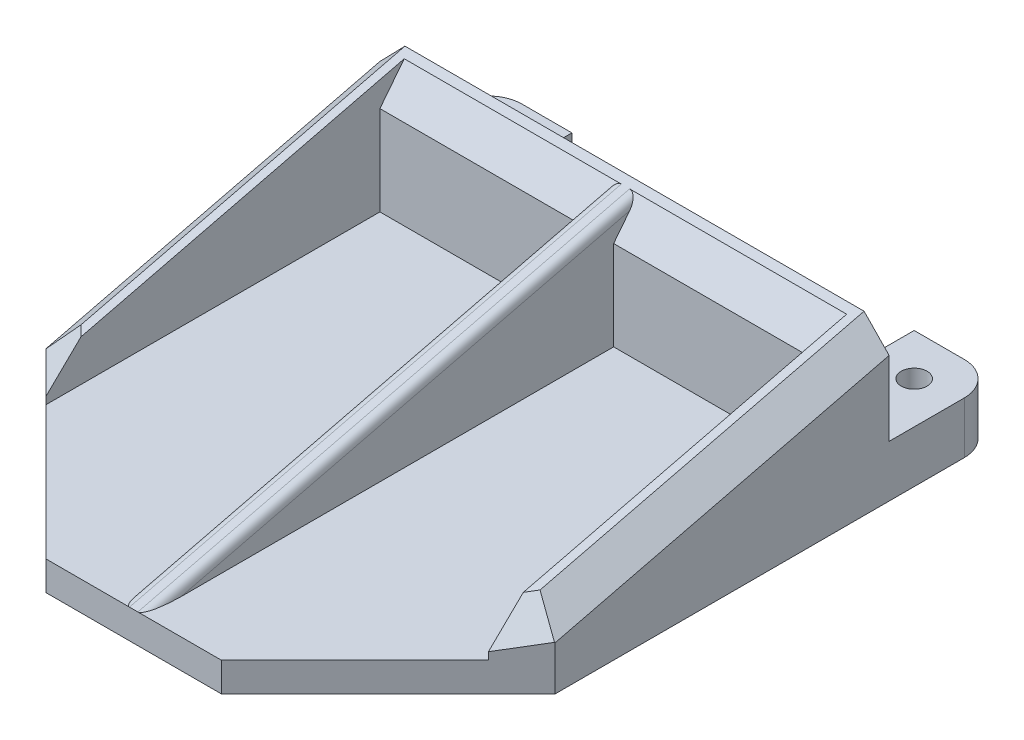
ISO-10303-21;
HEADER;
FILE_DESCRIPTION(('STEP AP214'),'2;1');
FILE_NAME('part.step','',(''),(''),'','','');
FILE_SCHEMA(('AUTOMOTIVE_DESIGN { 1 0 10303 214 1 1 1 1 }'));
ENDSEC;
DATA;
#1=APPLICATION_CONTEXT('core data for automotive mechanical design processes');
#2=APPLICATION_PROTOCOL_DEFINITION('international standard','automotive_design',2000,#1);
#3=PRODUCT_CONTEXT('',#1,'mechanical');
#4=PRODUCT('Part','Part','',(#3));
#5=PRODUCT_RELATED_PRODUCT_CATEGORY('part','',(#4));
#6=PRODUCT_DEFINITION_FORMATION('','',#4);
#7=PRODUCT_DEFINITION_CONTEXT('part definition',#1,'design');
#8=PRODUCT_DEFINITION('design','',#6,#7);
#9=PRODUCT_DEFINITION_SHAPE('','',#8);
#10=(LENGTH_UNIT() NAMED_UNIT(*) SI_UNIT(.MILLI.,.METRE.));
#11=(NAMED_UNIT(*) PLANE_ANGLE_UNIT() SI_UNIT($,.RADIAN.));
#12=(NAMED_UNIT(*) SI_UNIT($,.STERADIAN.) SOLID_ANGLE_UNIT());
#13=UNCERTAINTY_MEASURE_WITH_UNIT(LENGTH_MEASURE(1.E-05),#10,'distance_accuracy_value','');
#14=(GEOMETRIC_REPRESENTATION_CONTEXT(3) GLOBAL_UNCERTAINTY_ASSIGNED_CONTEXT((#13)) GLOBAL_UNIT_ASSIGNED_CONTEXT((#10,
#11,#12)) REPRESENTATION_CONTEXT('',''));
#15=CARTESIAN_POINT('',(0.,0.,0.));
#16=DIRECTION('',(0.,0.,1.));
#17=DIRECTION('',(1.,0.,0.));
#18=AXIS2_PLACEMENT_3D('',#15,#16,#17);
#19=CARTESIAN_POINT('',(30.5,1.75,0.));
#20=DIRECTION('',(1.,0.,0.));
#21=DIRECTION('',(0.,0.,-1.));
#22=AXIS2_PLACEMENT_3D('',#19,#20,#21);
#23=PLANE('',#22);
#24=DIRECTION('',(0.,1.,0.));
#25=VECTOR('',#24,1.);
#26=CARTESIAN_POINT('',(30.5,1.75,-28.5));
#27=LINE('',#26,#25);
#28=CARTESIAN_POINT('',(30.5,4.45,-28.5));
#29=VERTEX_POINT('',#28);
#30=CARTESIAN_POINT('',(30.5,13.3612745346988,-28.5));
#31=VERTEX_POINT('',#30);
#32=EDGE_CURVE('E557',#29,#31,#27,.T.);
#33=ORIENTED_EDGE('',*,*,#32,.T.);
#34=DIRECTION('',(0.,-0.237962230135701,0.971274408717147));
#35=VECTOR('',#34,1.);
#36=CARTESIAN_POINT('',(30.5,6.11666544156865,1.06983303318431));
#37=LINE('',#36,#35);
#38=CARTESIAN_POINT('',(30.5,3.5612745346988,11.5));
#39=VERTEX_POINT('',#38);
#40=EDGE_CURVE('E442',#31,#39,#37,.T.);
#41=ORIENTED_EDGE('',*,*,#40,.T.);
#42=DIRECTION('',(0.,-1.,0.));
#43=VECTOR('',#42,1.);
#44=CARTESIAN_POINT('',(30.5,1.75,11.5));
#45=LINE('',#44,#43);
#46=CARTESIAN_POINT('',(30.5,-1.75,11.5));
#47=VERTEX_POINT('',#46);
#48=EDGE_CURVE('E389',#39,#47,#45,.T.);
#49=ORIENTED_EDGE('',*,*,#48,.T.);
#50=DIRECTION('',(0.,0.,1.));
#51=VECTOR('',#50,1.);
#52=CARTESIAN_POINT('',(30.5,-1.75,0.));
#53=LINE('',#52,#51);
#54=CARTESIAN_POINT('',(30.5,-1.75,-37.5));
#55=VERTEX_POINT('',#54);
#56=EDGE_CURVE('E324',#55,#47,#53,.T.);
#57=ORIENTED_EDGE('',*,*,#56,.F.);
#58=DIRECTION('',(0.,-1.,0.));
#59=VECTOR('',#58,1.);
#60=CARTESIAN_POINT('',(30.5,1.75,-37.5));
#61=LINE('',#60,#59);
#62=CARTESIAN_POINT('',(30.5,4.45,-37.5));
#63=VERTEX_POINT('',#62);
#64=EDGE_CURVE('E386',#63,#55,#61,.T.);
#65=ORIENTED_EDGE('',*,*,#64,.F.);
#66=DIRECTION('',(0.,0.,-1.));
#67=VECTOR('',#66,1.);
#68=CARTESIAN_POINT('',(30.5,4.45,0.));
#69=LINE('',#68,#67);
#70=EDGE_CURVE('E577',#29,#63,#69,.T.);
#71=ORIENTED_EDGE('',*,*,#70,.F.);
#72=EDGE_LOOP('',(#33,#41,#49,#57,#65,#71));
#73=FACE_BOUND('',#72,.T.);
#74=ADVANCED_FACE('F78',(#73),#23,.T.);
#75=CARTESIAN_POINT('',(-30.5,1.75,0.));
#76=DIRECTION('',(1.,0.,0.));
#77=DIRECTION('',(0.,0.,-1.));
#78=AXIS2_PLACEMENT_3D('',#75,#76,#77);
#79=PLANE('',#78);
#80=DIRECTION('',(0.,-1.,0.));
#81=VECTOR('',#80,1.);
#82=CARTESIAN_POINT('',(-30.5,1.75,11.5));
#83=LINE('',#82,#81);
#84=CARTESIAN_POINT('',(-30.5,3.5612745346988,11.5));
#85=VERTEX_POINT('',#84);
#86=CARTESIAN_POINT('',(-30.5,-1.75,11.5));
#87=VERTEX_POINT('',#86);
#88=EDGE_CURVE('E311',#85,#87,#83,.T.);
#89=ORIENTED_EDGE('',*,*,#88,.F.);
#90=DIRECTION('',(0.,0.237962230135701,-0.971274408717147));
#91=VECTOR('',#90,1.);
#92=CARTESIAN_POINT('',(-30.5,13.5361767738485,-29.2138866904071));
#93=LINE('',#92,#91);
#94=CARTESIAN_POINT('',(-30.5,13.3612745346988,-28.5));
#95=VERTEX_POINT('',#94);
#96=EDGE_CURVE('E458',#85,#95,#93,.T.);
#97=ORIENTED_EDGE('',*,*,#96,.T.);
#98=DIRECTION('',(0.,1.,0.));
#99=VECTOR('',#98,1.);
#100=CARTESIAN_POINT('',(-30.5,1.75,-28.5));
#101=LINE('',#100,#99);
#102=CARTESIAN_POINT('',(-30.5,4.45,-28.5));
#103=VERTEX_POINT('',#102);
#104=EDGE_CURVE('E561',#103,#95,#101,.T.);
#105=ORIENTED_EDGE('',*,*,#104,.F.);
#106=DIRECTION('',(0.,0.,1.));
#107=VECTOR('',#106,1.);
#108=CARTESIAN_POINT('',(-30.5,4.45,0.));
#109=LINE('',#108,#107);
#110=CARTESIAN_POINT('',(-30.5,4.45,-37.5));
#111=VERTEX_POINT('',#110);
#112=EDGE_CURVE('E569',#111,#103,#109,.T.);
#113=ORIENTED_EDGE('',*,*,#112,.F.);
#114=DIRECTION('',(0.,-1.,0.));
#115=VECTOR('',#114,1.);
#116=CARTESIAN_POINT('',(-30.5,1.75,-37.5));
#117=LINE('',#116,#115);
#118=CARTESIAN_POINT('',(-30.5,-1.75,-37.5));
#119=VERTEX_POINT('',#118);
#120=EDGE_CURVE('E363',#111,#119,#117,.T.);
#121=ORIENTED_EDGE('',*,*,#120,.T.);
#122=DIRECTION('',(0.,0.,1.));
#123=VECTOR('',#122,1.);
#124=CARTESIAN_POINT('',(-30.5,-1.75,0.));
#125=LINE('',#124,#123);
#126=EDGE_CURVE('E354',#119,#87,#125,.T.);
#127=ORIENTED_EDGE('',*,*,#126,.T.);
#128=EDGE_LOOP('',(#89,#97,#105,#113,#121,#127));
#129=FACE_BOUND('',#128,.T.);
#130=ADVANCED_FACE('F636',(#129),#79,.F.);
#131=CARTESIAN_POINT('',(-30.5,1.75,31.5));
#132=DIRECTION('',(0.,0.971274408717147,0.237962230135701));
#133=DIRECTION('',(0.,-0.237962230135701,0.971274408717147));
#134=AXIS2_PLACEMENT_3D('',#131,#132,#133);
#135=PLANE('',#134);
#136=DIRECTION('',(-1.,0.,0.));
#137=VECTOR('',#136,1.);
#138=CARTESIAN_POINT('',(0.,1.75,31.5));
#139=LINE('',#138,#137);
#140=CARTESIAN_POINT('',(0.500000000000004,1.75,31.5));
#141=VERTEX_POINT('',#140);
#142=CARTESIAN_POINT('',(-0.500000000000004,1.75,31.5));
#143=VERTEX_POINT('',#142);
#144=EDGE_CURVE('E301',#141,#143,#139,.T.);
#145=ORIENTED_EDGE('',*,*,#144,.F.);
#146=DIRECTION('',(0.,-0.237962230135701,0.971274408717147));
#147=VECTOR('',#146,1.);
#148=CARTESIAN_POINT('',(0.499999999999982,16.1838866904071,-27.4138232261515));
#149=LINE('',#148,#147);
#150=CARTESIAN_POINT('',(0.499999999999983,16.1838866904071,-27.4138232261515));
#151=VERTEX_POINT('',#150);
#152=EDGE_CURVE('E491',#141,#151,#149,.F.);
#153=ORIENTED_EDGE('',*,*,#152,.T.);
#154=DIRECTION('',(1.,0.,0.));
#155=VECTOR('',#154,1.);
#156=CARTESIAN_POINT('',(26.5,16.1838866904071,-27.4138232261515));
#157=LINE('',#156,#155);
#158=CARTESIAN_POINT('',(26.5,16.1838866904071,-27.4138232261515));
#159=VERTEX_POINT('',#158);
#160=EDGE_CURVE('E414',#151,#159,#157,.T.);
#161=ORIENTED_EDGE('',*,*,#160,.T.);
#162=DIRECTION('',(0.,-0.237962230135701,0.971274408717147));
#163=VECTOR('',#162,1.);
#164=CARTESIAN_POINT('',(26.5,1.75000000000001,31.5));
#165=LINE('',#164,#163);
#166=CARTESIAN_POINT('',(26.5,6.69462637421668,11.3178515338095));
#167=VERTEX_POINT('',#166);
#168=EDGE_CURVE('E397',#159,#167,#165,.T.);
#169=ORIENTED_EDGE('',*,*,#168,.T.);
#170=DIRECTION('',(0.696728786581225,0.1706985527124,-0.696728786581225));
#171=VECTOR('',#170,1.);
#172=CARTESIAN_POINT('',(-11.5546750296106,-2.62876900803793,49.3725265634201));
#173=LINE('',#172,#171);
#174=CARTESIAN_POINT('',(27.5,6.93962637421667,10.3178515338095));
#175=VERTEX_POINT('',#174);
#176=EDGE_CURVE('E421',#167,#175,#173,.T.);
#177=ORIENTED_EDGE('',*,*,#176,.T.);
#178=DIRECTION('',(0.,0.237962230135701,-0.971274408717147));
#179=VECTOR('',#178,1.);
#180=CARTESIAN_POINT('',(27.5,1.75,31.5));
#181=LINE('',#180,#179);
#182=CARTESIAN_POINT('',(27.5,16.45,-28.5));
#183=VERTEX_POINT('',#182);
#184=EDGE_CURVE('E418',#175,#183,#181,.T.);
#185=ORIENTED_EDGE('',*,*,#184,.T.);
#186=DIRECTION('',(1.,0.,0.));
#187=VECTOR('',#186,1.);
#188=CARTESIAN_POINT('',(-30.5,16.45,-28.5));
#189=LINE('',#188,#187);
#190=CARTESIAN_POINT('',(-27.5,16.45,-28.5));
#191=VERTEX_POINT('',#190);
#192=EDGE_CURVE('E565',#191,#183,#189,.T.);
#193=ORIENTED_EDGE('',*,*,#192,.F.);
#194=DIRECTION('',(0.,-0.237962230135701,0.971274408717147));
#195=VECTOR('',#194,1.);
#196=CARTESIAN_POINT('',(-27.5,6.65,11.5));
#197=LINE('',#196,#195);
#198=CARTESIAN_POINT('',(-27.5,6.93962637421668,10.3178515338095));
#199=VERTEX_POINT('',#198);
#200=EDGE_CURVE('E404',#191,#199,#197,.T.);
#201=ORIENTED_EDGE('',*,*,#200,.T.);
#202=DIRECTION('',(0.696728786581225,-0.1706985527124,0.696728786581225));
#203=VECTOR('',#202,1.);
#204=CARTESIAN_POINT('',(-18.0566160954971,4.62599731761347,19.7612354383124));
#205=LINE('',#204,#203);
#206=CARTESIAN_POINT('',(-26.5,6.69462637421668,11.3178515338095));
#207=VERTEX_POINT('',#206);
#208=EDGE_CURVE('E407',#199,#207,#205,.T.);
#209=ORIENTED_EDGE('',*,*,#208,.T.);
#210=DIRECTION('',(0.,-0.237962230135701,0.971274408717147));
#211=VECTOR('',#210,1.);
#212=CARTESIAN_POINT('',(-26.5,1.75,31.5));
#213=LINE('',#212,#211);
#214=CARTESIAN_POINT('',(-26.5,16.1838866904071,-27.4138232261515));
#215=VERTEX_POINT('',#214);
#216=EDGE_CURVE('E401',#215,#207,#213,.T.);
#217=ORIENTED_EDGE('',*,*,#216,.F.);
#218=DIRECTION('',(1.,0.,0.));
#219=VECTOR('',#218,1.);
#220=CARTESIAN_POINT('',(-30.5,16.1838866904071,-27.4138232261515));
#221=LINE('',#220,#219);
#222=CARTESIAN_POINT('',(-0.499999999999994,16.1838866904071,-27.4138232261515));
#223=VERTEX_POINT('',#222);
#224=EDGE_CURVE('E411',#215,#223,#221,.T.);
#225=ORIENTED_EDGE('',*,*,#224,.T.);
#226=DIRECTION('',(0.,-0.237962230135701,0.971274408717147));
#227=VECTOR('',#226,1.);
#228=CARTESIAN_POINT('',(-0.500000000000004,1.75,31.5));
#229=LINE('',#228,#227);
#230=EDGE_CURVE('E487',#223,#143,#229,.T.);
#231=ORIENTED_EDGE('',*,*,#230,.T.);
#232=EDGE_LOOP('',(#145,#153,#161,#169,#177,#185,#193,#201,#209,#217,#225,#231));
#233=FACE_BOUND('',#232,.T.);
#234=ADVANCED_FACE('F642',(#233),#135,.T.);
#235=CARTESIAN_POINT('',(-21.,1.75,21.));
#236=DIRECTION('',(-0.707106781186548,0.,0.707106781186548));
#237=DIRECTION('',(0.707106781186548,0.,0.707106781186547));
#238=AXIS2_PLACEMENT_3D('',#235,#236,#237);
#239=PLANE('',#238);
#240=DIRECTION('',(0.,1.,0.));
#241=VECTOR('',#240,1.);
#242=CARTESIAN_POINT('',(-26.5,1.75,15.5));
#243=LINE('',#242,#241);
#244=CARTESIAN_POINT('',(-26.5,1.75,15.5));
#245=VERTEX_POINT('',#244);
#246=CARTESIAN_POINT('',(-26.5,2.6253140556044,15.5));
#247=VERTEX_POINT('',#246);
#248=EDGE_CURVE('E266',#245,#247,#243,.T.);
#249=ORIENTED_EDGE('',*,*,#248,.T.);
#250=DIRECTION('',(-0.696728786581225,0.1706985527124,-0.696728786581225));
#251=VECTOR('',#250,1.);
#252=CARTESIAN_POINT('',(-21.0561573555549,1.29157260771534,20.9438426444451));
#253=LINE('',#252,#251);
#254=CARTESIAN_POINT('',(-30.4572255403722,3.59483431299559,11.5427744596278));
#255=VERTEX_POINT('',#254);
#256=EDGE_CURVE('E439',#247,#255,#253,.T.);
#257=ORIENTED_EDGE('',*,*,#256,.T.);
#258=DIRECTION('',(-0.618326426470226,-0.485123551950552,-0.618326426470226));
#259=VECTOR('',#258,1.);
#260=CARTESIAN_POINT('',(-23.779094620893,8.83432991492676,18.220905379107));
#261=LINE('',#260,#259);
#262=EDGE_CURVE('E436',#255,#85,#261,.T.);
#263=ORIENTED_EDGE('',*,*,#262,.T.);
#264=ORIENTED_EDGE('',*,*,#88,.T.);
#265=DIRECTION('',(-0.707106781186548,0.,-0.707106781186547));
#266=VECTOR('',#265,1.);
#267=CARTESIAN_POINT('',(-21.,-1.75,21.));
#268=LINE('',#267,#266);
#269=CARTESIAN_POINT('',(-10.5,-1.75,31.5));
#270=VERTEX_POINT('',#269);
#271=EDGE_CURVE('E312',#270,#87,#268,.T.);
#272=ORIENTED_EDGE('',*,*,#271,.F.);
#273=DIRECTION('',(0.,-1.,0.));
#274=VECTOR('',#273,1.);
#275=CARTESIAN_POINT('',(-10.5,1.75,31.5));
#276=LINE('',#275,#274);
#277=CARTESIAN_POINT('',(-10.5,1.75,31.5));
#278=VERTEX_POINT('',#277);
#279=EDGE_CURVE('E294',#278,#270,#276,.T.);
#280=ORIENTED_EDGE('',*,*,#279,.F.);
#281=DIRECTION('',(-0.707106781186548,0.,-0.707106781186547));
#282=VECTOR('',#281,1.);
#283=CARTESIAN_POINT('',(-21.,1.75,21.));
#284=LINE('',#283,#282);
#285=EDGE_CURVE('E284',#278,#245,#284,.T.);
#286=ORIENTED_EDGE('',*,*,#285,.T.);
#287=EDGE_LOOP('',(#249,#257,#263,#264,#272,#280,#286));
#288=FACE_BOUND('',#287,.T.);
#289=ADVANCED_FACE('F292',(#288),#239,.T.);
#290=CARTESIAN_POINT('',(0.,1.75,31.5));
#291=DIRECTION('',(0.,0.,1.));
#292=DIRECTION('',(1.,0.,0.));
#293=AXIS2_PLACEMENT_3D('',#290,#291,#292);
#294=PLANE('',#293);
#295=DIRECTION('',(-1.,0.,0.));
#296=VECTOR('',#295,1.);
#297=CARTESIAN_POINT('',(0.,-1.75,31.5));
#298=LINE('',#297,#296);
#299=CARTESIAN_POINT('',(10.5,-1.75,31.5));
#300=VERTEX_POINT('',#299);
#301=EDGE_CURVE('E316',#300,#270,#298,.T.);
#302=ORIENTED_EDGE('',*,*,#301,.F.);
#303=DIRECTION('',(0.,-1.,0.));
#304=VECTOR('',#303,1.);
#305=CARTESIAN_POINT('',(10.5,1.75,31.5));
#306=LINE('',#305,#304);
#307=CARTESIAN_POINT('',(10.5,1.75,31.5));
#308=VERTEX_POINT('',#307);
#309=EDGE_CURVE('E392',#308,#300,#306,.T.);
#310=ORIENTED_EDGE('',*,*,#309,.F.);
#311=EDGE_CURVE('E95',#308,#141,#139,.T.);
#312=ORIENTED_EDGE('',*,*,#311,.T.);
#313=ORIENTED_EDGE('',*,*,#144,.T.);
#314=EDGE_CURVE('E296',#143,#278,#139,.T.);
#315=ORIENTED_EDGE('',*,*,#314,.T.);
#316=ORIENTED_EDGE('',*,*,#279,.T.);
#317=EDGE_LOOP('',(#302,#310,#312,#313,#315,#316));
#318=FACE_BOUND('',#317,.T.);
#319=ADVANCED_FACE('F652',(#318),#294,.T.);
#320=CARTESIAN_POINT('',(21.,1.75,21.));
#321=DIRECTION('',(0.707106781186548,0.,0.707106781186548));
#322=DIRECTION('',(0.707106781186547,0.,-0.707106781186548));
#323=AXIS2_PLACEMENT_3D('',#320,#321,#322);
#324=PLANE('',#323);
#325=DIRECTION('',(0.618326426470227,-0.48512355195055,-0.618326426470227));
#326=VECTOR('',#325,1.);
#327=CARTESIAN_POINT('',(23.779094620893,8.83432991492674,18.220905379107));
#328=LINE('',#327,#326);
#329=CARTESIAN_POINT('',(30.4572255403722,3.59483431299561,11.5427744596278));
#330=VERTEX_POINT('',#329);
#331=EDGE_CURVE('E425',#39,#330,#328,.F.);
#332=ORIENTED_EDGE('',*,*,#331,.T.);
#333=DIRECTION('',(-0.696728786581225,-0.1706985527124,0.696728786581225));
#334=VECTOR('',#333,1.);
#335=CARTESIAN_POINT('',(21.0561573555549,1.29157260771535,20.9438426444451));
#336=LINE('',#335,#334);
#337=CARTESIAN_POINT('',(26.5,2.62531405560441,15.5));
#338=VERTEX_POINT('',#337);
#339=EDGE_CURVE('E428',#330,#338,#336,.T.);
#340=ORIENTED_EDGE('',*,*,#339,.T.);
#341=DIRECTION('',(0.,1.,0.));
#342=VECTOR('',#341,1.);
#343=CARTESIAN_POINT('',(26.5,1.75,15.5));
#344=LINE('',#343,#342);
#345=CARTESIAN_POINT('',(26.5,1.75,15.5));
#346=VERTEX_POINT('',#345);
#347=EDGE_CURVE('E479',#346,#338,#344,.T.);
#348=ORIENTED_EDGE('',*,*,#347,.F.);
#349=DIRECTION('',(0.707106781186547,0.,-0.707106781186548));
#350=VECTOR('',#349,1.);
#351=CARTESIAN_POINT('',(21.,1.75,21.));
#352=LINE('',#351,#350);
#353=EDGE_CURVE('E277',#308,#346,#352,.T.);
#354=ORIENTED_EDGE('',*,*,#353,.F.);
#355=ORIENTED_EDGE('',*,*,#309,.T.);
#356=DIRECTION('',(-0.707106781186547,0.,0.707106781186548));
#357=VECTOR('',#356,1.);
#358=CARTESIAN_POINT('',(21.,-1.75,21.));
#359=LINE('',#358,#357);
#360=EDGE_CURVE('E320',#47,#300,#359,.T.);
#361=ORIENTED_EDGE('',*,*,#360,.F.);
#362=ORIENTED_EDGE('',*,*,#48,.F.);
#363=EDGE_LOOP('',(#332,#340,#348,#354,#355,#361,#362));
#364=FACE_BOUND('',#363,.T.);
#365=ADVANCED_FACE('F649',(#364),#324,.T.);
#366=CARTESIAN_POINT('',(26.5,1.75,-37.5));
#367=DIRECTION('',(0.,-1.,0.));
#368=DIRECTION('',(0.,0.,-1.));
#369=AXIS2_PLACEMENT_3D('',#366,#367,#368);
#370=CYLINDRICAL_SURFACE('',#369,4.);
#371=CARTESIAN_POINT('',(26.5,-1.75,-37.5));
#372=DIRECTION('',(0.,1.,0.));
#373=DIRECTION('',(0.,0.,1.));
#374=AXIS2_PLACEMENT_3D('',#371,#372,#373);
#375=CIRCLE('',#374,4.);
#376=CARTESIAN_POINT('',(26.5,-1.75,-41.5));
#377=VERTEX_POINT('',#376);
#378=EDGE_CURVE('E328',#55,#377,#375,.T.);
#379=ORIENTED_EDGE('',*,*,#378,.T.);
#380=DIRECTION('',(0.,-1.,0.));
#381=VECTOR('',#380,1.);
#382=CARTESIAN_POINT('',(26.5,1.75,-41.5));
#383=LINE('',#382,#381);
#384=CARTESIAN_POINT('',(26.5,4.45,-41.5));
#385=VERTEX_POINT('',#384);
#386=EDGE_CURVE('E382',#385,#377,#383,.T.);
#387=ORIENTED_EDGE('',*,*,#386,.F.);
#388=CARTESIAN_POINT('',(26.5,4.45,-37.5));
#389=DIRECTION('',(0.,1.,0.));
#390=DIRECTION('',(0.,0.,1.));
#391=AXIS2_PLACEMENT_3D('',#388,#389,#390);
#392=CIRCLE('',#391,4.);
#393=EDGE_CURVE('E581',#63,#385,#392,.T.);
#394=ORIENTED_EDGE('',*,*,#393,.F.);
#395=ORIENTED_EDGE('',*,*,#64,.T.);
#396=EDGE_LOOP('',(#379,#387,#394,#395));
#397=FACE_BOUND('',#396,.T.);
#398=ADVANCED_FACE('F647',(#397),#370,.T.);
#399=CARTESIAN_POINT('',(0.,1.75,-41.5));
#400=DIRECTION('',(0.,0.,1.));
#401=DIRECTION('',(1.,0.,0.));
#402=AXIS2_PLACEMENT_3D('',#399,#400,#401);
#403=PLANE('',#402);
#404=DIRECTION('',(-1.,0.,0.));
#405=VECTOR('',#404,1.);
#406=CARTESIAN_POINT('',(0.,-1.75,-41.5));
#407=LINE('',#406,#405);
#408=CARTESIAN_POINT('',(20.5,-1.75,-41.5));
#409=VERTEX_POINT('',#408);
#410=EDGE_CURVE('E331',#377,#409,#407,.T.);
#411=ORIENTED_EDGE('',*,*,#410,.T.);
#412=DIRECTION('',(0.,-1.,0.));
#413=VECTOR('',#412,1.);
#414=CARTESIAN_POINT('',(20.5,1.75,-41.5));
#415=LINE('',#414,#413);
#416=CARTESIAN_POINT('',(20.5,4.45,-41.5));
#417=VERTEX_POINT('',#416);
#418=EDGE_CURVE('E379',#417,#409,#415,.T.);
#419=ORIENTED_EDGE('',*,*,#418,.F.);
#420=DIRECTION('',(-1.,0.,0.));
#421=VECTOR('',#420,1.);
#422=CARTESIAN_POINT('',(0.,4.45,-41.5));
#423=LINE('',#422,#421);
#424=EDGE_CURVE('E585',#385,#417,#423,.T.);
#425=ORIENTED_EDGE('',*,*,#424,.F.);
#426=ORIENTED_EDGE('',*,*,#386,.T.);
#427=EDGE_LOOP('',(#411,#419,#425,#426));
#428=FACE_BOUND('',#427,.T.);
#429=ADVANCED_FACE('F749',(#428),#403,.F.);
#430=CARTESIAN_POINT('',(20.5,1.75,0.));
#431=DIRECTION('',(-1.,0.,0.));
#432=DIRECTION('',(0.,0.,1.));
#433=AXIS2_PLACEMENT_3D('',#430,#431,#432);
#434=PLANE('',#433);
#435=DIRECTION('',(0.,0.,-1.));
#436=VECTOR('',#435,1.);
#437=CARTESIAN_POINT('',(20.5,-1.75,0.));
#438=LINE('',#437,#436);
#439=CARTESIAN_POINT('',(20.5,-1.75,-31.5));
#440=VERTEX_POINT('',#439);
#441=EDGE_CURVE('E335',#440,#409,#438,.T.);
#442=ORIENTED_EDGE('',*,*,#441,.F.);
#443=DIRECTION('',(0.,-1.,0.));
#444=VECTOR('',#443,1.);
#445=CARTESIAN_POINT('',(20.5,1.75,-31.5));
#446=LINE('',#445,#444);
#447=CARTESIAN_POINT('',(20.5,4.45,-31.5));
#448=VERTEX_POINT('',#447);
#449=EDGE_CURVE('E376',#448,#440,#446,.T.);
#450=ORIENTED_EDGE('',*,*,#449,.F.);
#451=DIRECTION('',(0.,0.,1.));
#452=VECTOR('',#451,1.);
#453=CARTESIAN_POINT('',(20.5,4.45,0.));
#454=LINE('',#453,#452);
#455=EDGE_CURVE('E589',#417,#448,#454,.T.);
#456=ORIENTED_EDGE('',*,*,#455,.F.);
#457=ORIENTED_EDGE('',*,*,#418,.T.);
#458=EDGE_LOOP('',(#442,#450,#456,#457));
#459=FACE_BOUND('',#458,.T.);
#460=ADVANCED_FACE('F754',(#459),#434,.T.);
#461=CARTESIAN_POINT('',(0.,1.75,-31.5));
#462=DIRECTION('',(0.,0.,1.));
#463=DIRECTION('',(1.,0.,0.));
#464=AXIS2_PLACEMENT_3D('',#461,#462,#463);
#465=PLANE('',#464);
#466=DIRECTION('',(-1.,0.,0.));
#467=VECTOR('',#466,1.);
#468=CARTESIAN_POINT('',(0.,-1.75,-31.5));
#469=LINE('',#468,#467);
#470=CARTESIAN_POINT('',(-20.5,-1.75,-31.5));
#471=VERTEX_POINT('',#470);
#472=EDGE_CURVE('E339',#440,#471,#469,.T.);
#473=ORIENTED_EDGE('',*,*,#472,.T.);
#474=DIRECTION('',(0.,-1.,0.));
#475=VECTOR('',#474,1.);
#476=CARTESIAN_POINT('',(-20.5,1.75,-31.5));
#477=LINE('',#476,#475);
#478=CARTESIAN_POINT('',(-20.5,4.45,-31.5));
#479=VERTEX_POINT('',#478);
#480=EDGE_CURVE('E372',#479,#471,#477,.T.);
#481=ORIENTED_EDGE('',*,*,#480,.F.);
#482=DIRECTION('',(1.,0.,0.));
#483=VECTOR('',#482,1.);
#484=CARTESIAN_POINT('',(0.,4.45,-31.5));
#485=LINE('',#484,#483);
#486=EDGE_CURVE('E593',#479,#448,#485,.T.);
#487=ORIENTED_EDGE('',*,*,#486,.T.);
#488=ORIENTED_EDGE('',*,*,#449,.T.);
#489=EDGE_LOOP('',(#473,#481,#487,#488));
#490=FACE_BOUND('',#489,.T.);
#491=ADVANCED_FACE('F758',(#490),#465,.F.);
#492=CARTESIAN_POINT('',(-20.5,1.75,0.));
#493=DIRECTION('',(-1.,0.,0.));
#494=DIRECTION('',(0.,0.,1.));
#495=AXIS2_PLACEMENT_3D('',#492,#493,#494);
#496=PLANE('',#495);
#497=DIRECTION('',(0.,0.,-1.));
#498=VECTOR('',#497,1.);
#499=CARTESIAN_POINT('',(-20.5,-1.75,0.));
#500=LINE('',#499,#498);
#501=CARTESIAN_POINT('',(-20.5,-1.75,-41.5));
#502=VERTEX_POINT('',#501);
#503=EDGE_CURVE('E342',#471,#502,#500,.T.);
#504=ORIENTED_EDGE('',*,*,#503,.T.);
#505=DIRECTION('',(0.,-1.,0.));
#506=VECTOR('',#505,1.);
#507=CARTESIAN_POINT('',(-20.5,1.75,-41.5));
#508=LINE('',#507,#506);
#509=CARTESIAN_POINT('',(-20.5,4.45,-41.5));
#510=VERTEX_POINT('',#509);
#511=EDGE_CURVE('E369',#510,#502,#508,.T.);
#512=ORIENTED_EDGE('',*,*,#511,.F.);
#513=DIRECTION('',(0.,0.,-1.));
#514=VECTOR('',#513,1.);
#515=CARTESIAN_POINT('',(-20.5,4.45,0.));
#516=LINE('',#515,#514);
#517=EDGE_CURVE('E597',#479,#510,#516,.T.);
#518=ORIENTED_EDGE('',*,*,#517,.F.);
#519=ORIENTED_EDGE('',*,*,#480,.T.);
#520=EDGE_LOOP('',(#504,#512,#518,#519));
#521=FACE_BOUND('',#520,.T.);
#522=ADVANCED_FACE('F761',(#521),#496,.F.);
#523=CARTESIAN_POINT('',(0.,1.75,-41.5));
#524=DIRECTION('',(0.,0.,-1.));
#525=DIRECTION('',(-1.,0.,0.));
#526=AXIS2_PLACEMENT_3D('',#523,#524,#525);
#527=PLANE('',#526);
#528=DIRECTION('',(1.,0.,0.));
#529=VECTOR('',#528,1.);
#530=CARTESIAN_POINT('',(0.,-1.75,-41.5));
#531=LINE('',#530,#529);
#532=CARTESIAN_POINT('',(-26.5,-1.75,-41.5));
#533=VERTEX_POINT('',#532);
#534=EDGE_CURVE('E346',#533,#502,#531,.T.);
#535=ORIENTED_EDGE('',*,*,#534,.F.);
#536=DIRECTION('',(0.,-1.,0.));
#537=VECTOR('',#536,1.);
#538=CARTESIAN_POINT('',(-26.5,1.75,-41.5));
#539=LINE('',#538,#537);
#540=CARTESIAN_POINT('',(-26.5,4.45,-41.5));
#541=VERTEX_POINT('',#540);
#542=EDGE_CURVE('E366',#541,#533,#539,.T.);
#543=ORIENTED_EDGE('',*,*,#542,.F.);
#544=DIRECTION('',(-1.,0.,0.));
#545=VECTOR('',#544,1.);
#546=CARTESIAN_POINT('',(0.,4.45,-41.5));
#547=LINE('',#546,#545);
#548=EDGE_CURVE('E601',#510,#541,#547,.T.);
#549=ORIENTED_EDGE('',*,*,#548,.F.);
#550=ORIENTED_EDGE('',*,*,#511,.T.);
#551=EDGE_LOOP('',(#535,#543,#549,#550));
#552=FACE_BOUND('',#551,.T.);
#553=ADVANCED_FACE('F766',(#552),#527,.T.);
#554=CARTESIAN_POINT('',(-26.5,1.75,-37.5));
#555=DIRECTION('',(0.,-1.,0.));
#556=DIRECTION('',(0.,0.,-1.));
#557=AXIS2_PLACEMENT_3D('',#554,#555,#556);
#558=CYLINDRICAL_SURFACE('',#557,4.);
#559=CARTESIAN_POINT('',(-26.5,-1.75,-37.5));
#560=DIRECTION('',(0.,1.,0.));
#561=DIRECTION('',(0.,0.,1.));
#562=AXIS2_PLACEMENT_3D('',#559,#560,#561);
#563=CIRCLE('',#562,4.);
#564=EDGE_CURVE('E350',#119,#533,#563,.F.);
#565=ORIENTED_EDGE('',*,*,#564,.F.);
#566=ORIENTED_EDGE('',*,*,#120,.F.);
#567=CARTESIAN_POINT('',(-26.5,4.45,-37.5));
#568=DIRECTION('',(0.,1.,0.));
#569=DIRECTION('',(0.,0.,1.));
#570=AXIS2_PLACEMENT_3D('',#567,#568,#569);
#571=CIRCLE('',#570,4.);
#572=EDGE_CURVE('E605',#541,#111,#571,.T.);
#573=ORIENTED_EDGE('',*,*,#572,.F.);
#574=ORIENTED_EDGE('',*,*,#542,.T.);
#575=EDGE_LOOP('',(#565,#566,#573,#574));
#576=FACE_BOUND('',#575,.T.);
#577=ADVANCED_FACE('F631',(#576),#558,.T.);
#578=CARTESIAN_POINT('',(-25.5,1.75,-36.5));
#579=DIRECTION('',(0.,-1.,0.));
#580=DIRECTION('',(0.,0.,-1.));
#581=AXIS2_PLACEMENT_3D('',#578,#579,#580);
#582=CYLINDRICAL_SURFACE('',#581,1.55);
#583=CARTESIAN_POINT('',(-25.5,-1.75,-36.5));
#584=DIRECTION('',(0.,1.,0.));
#585=DIRECTION('',(0.,0.,1.));
#586=AXIS2_PLACEMENT_3D('',#583,#584,#585);
#587=CIRCLE('',#586,1.55);
#588=CARTESIAN_POINT('',(-25.5,-1.75,-34.95));
#589=VERTEX_POINT('',#588);
#590=EDGE_CURVE('E304',#589,#589,#587,.T.);
#591=ORIENTED_EDGE('',*,*,#590,.F.);
#592=EDGE_LOOP('',(#591));
#593=FACE_BOUND('',#592,.T.);
#594=CARTESIAN_POINT('',(-25.5,4.45,-36.5));
#595=DIRECTION('',(0.,1.,0.));
#596=DIRECTION('',(0.,0.,1.));
#597=AXIS2_PLACEMENT_3D('',#594,#595,#596);
#598=CIRCLE('',#597,1.55);
#599=CARTESIAN_POINT('',(-25.5,4.45,-34.95));
#600=VERTEX_POINT('',#599);
#601=EDGE_CURVE('E608',#600,#600,#598,.F.);
#602=ORIENTED_EDGE('',*,*,#601,.F.);
#603=EDGE_LOOP('',(#602));
#604=FACE_BOUND('',#603,.T.);
#605=ADVANCED_FACE('F622',(#593,#604),#582,.F.);
#606=CARTESIAN_POINT('',(25.5,1.75,-36.5));
#607=DIRECTION('',(0.,-1.,0.));
#608=DIRECTION('',(0.,0.,-1.));
#609=AXIS2_PLACEMENT_3D('',#606,#607,#608);
#610=CYLINDRICAL_SURFACE('',#609,1.55);
#611=CARTESIAN_POINT('',(25.5,-1.75,-36.5));
#612=DIRECTION('',(0.,1.,0.));
#613=DIRECTION('',(0.,0.,1.));
#614=AXIS2_PLACEMENT_3D('',#611,#612,#613);
#615=CIRCLE('',#614,1.55);
#616=CARTESIAN_POINT('',(25.5,-1.75,-34.95));
#617=VERTEX_POINT('',#616);
#618=EDGE_CURVE('E297',#617,#617,#615,.T.);
#619=ORIENTED_EDGE('',*,*,#618,.F.);
#620=EDGE_LOOP('',(#619));
#621=FACE_BOUND('',#620,.T.);
#622=CARTESIAN_POINT('',(25.5,4.45,-36.5));
#623=DIRECTION('',(0.,1.,0.));
#624=DIRECTION('',(0.,0.,1.));
#625=AXIS2_PLACEMENT_3D('',#622,#623,#624);
#626=CIRCLE('',#625,1.55);
#627=CARTESIAN_POINT('',(25.5,4.45,-34.95));
#628=VERTEX_POINT('',#627);
#629=EDGE_CURVE('E307',#628,#628,#626,.F.);
#630=ORIENTED_EDGE('',*,*,#629,.F.);
#631=EDGE_LOOP('',(#630));
#632=FACE_BOUND('',#631,.T.);
#633=ADVANCED_FACE('F619',(#621,#632),#610,.F.);
#634=CARTESIAN_POINT('',(0.,-1.75,0.));
#635=DIRECTION('',(0.,1.,0.));
#636=DIRECTION('',(0.,0.,1.));
#637=AXIS2_PLACEMENT_3D('',#634,#635,#636);
#638=PLANE('',#637);
#639=ORIENTED_EDGE('',*,*,#271,.T.);
#640=ORIENTED_EDGE('',*,*,#126,.F.);
#641=ORIENTED_EDGE('',*,*,#564,.T.);
#642=ORIENTED_EDGE('',*,*,#534,.T.);
#643=ORIENTED_EDGE('',*,*,#503,.F.);
#644=ORIENTED_EDGE('',*,*,#472,.F.);
#645=ORIENTED_EDGE('',*,*,#441,.T.);
#646=ORIENTED_EDGE('',*,*,#410,.F.);
#647=ORIENTED_EDGE('',*,*,#378,.F.);
#648=ORIENTED_EDGE('',*,*,#56,.T.);
#649=ORIENTED_EDGE('',*,*,#360,.T.);
#650=ORIENTED_EDGE('',*,*,#301,.T.);
#651=EDGE_LOOP('',(#639,#640,#641,#642,#643,#644,#645,#646,#647,#648,#649,#650));
#652=FACE_BOUND('',#651,.T.);
#653=ORIENTED_EDGE('',*,*,#590,.T.);
#654=EDGE_LOOP('',(#653));
#655=FACE_BOUND('',#654,.T.);
#656=ORIENTED_EDGE('',*,*,#618,.T.);
#657=EDGE_LOOP('',(#656));
#658=FACE_BOUND('',#657,.T.);
#659=ADVANCED_FACE('F621',(#652,#655,#658),#638,.F.);
#660=CARTESIAN_POINT('',(0.,4.45,0.));
#661=DIRECTION('',(0.,1.,0.));
#662=DIRECTION('',(0.,0.,1.));
#663=AXIS2_PLACEMENT_3D('',#660,#661,#662);
#664=PLANE('',#663);
#665=ORIENTED_EDGE('',*,*,#112,.T.);
#666=DIRECTION('',(1.,0.,0.));
#667=VECTOR('',#666,1.);
#668=CARTESIAN_POINT('',(0.,4.45,-28.5));
#669=LINE('',#668,#667);
#670=EDGE_CURVE('E573',#103,#29,#669,.T.);
#671=ORIENTED_EDGE('',*,*,#670,.T.);
#672=ORIENTED_EDGE('',*,*,#70,.T.);
#673=ORIENTED_EDGE('',*,*,#393,.T.);
#674=ORIENTED_EDGE('',*,*,#424,.T.);
#675=ORIENTED_EDGE('',*,*,#455,.T.);
#676=ORIENTED_EDGE('',*,*,#486,.F.);
#677=ORIENTED_EDGE('',*,*,#517,.T.);
#678=ORIENTED_EDGE('',*,*,#548,.T.);
#679=ORIENTED_EDGE('',*,*,#572,.T.);
#680=EDGE_LOOP('',(#665,#671,#672,#673,#674,#675,#676,#677,#678,#679));
#681=FACE_BOUND('',#680,.T.);
#682=ORIENTED_EDGE('',*,*,#601,.T.);
#683=EDGE_LOOP('',(#682));
#684=FACE_BOUND('',#683,.T.);
#685=ORIENTED_EDGE('',*,*,#629,.T.);
#686=EDGE_LOOP('',(#685));
#687=FACE_BOUND('',#686,.T.);
#688=ADVANCED_FACE('F617',(#681,#684,#687),#664,.T.);
#689=CARTESIAN_POINT('',(-30.5,1.75,-28.5));
#690=DIRECTION('',(0.,0.,-1.));
#691=DIRECTION('',(-1.,0.,0.));
#692=AXIS2_PLACEMENT_3D('',#689,#690,#691);
#693=PLANE('',#692);
#694=ORIENTED_EDGE('',*,*,#192,.T.);
#695=DIRECTION('',(-0.696728786581225,0.717334648507273,0.));
#696=VECTOR('',#695,1.);
#697=CARTESIAN_POINT('',(6.69188105968407,37.8735222853232,-28.5));
#698=LINE('',#697,#696);
#699=EDGE_CURVE('E448',#183,#31,#698,.F.);
#700=ORIENTED_EDGE('',*,*,#699,.T.);
#701=ORIENTED_EDGE('',*,*,#32,.F.);
#702=ORIENTED_EDGE('',*,*,#670,.F.);
#703=ORIENTED_EDGE('',*,*,#104,.T.);
#704=DIRECTION('',(0.696728786581223,0.717334648507275,0.));
#705=VECTOR('',#704,1.);
#706=CARTESIAN_POINT('',(-36.3031721847918,7.38647263246745,-28.5));
#707=LINE('',#706,#705);
#708=EDGE_CURVE('E445',#95,#191,#707,.T.);
#709=ORIENTED_EDGE('',*,*,#708,.T.);
#710=EDGE_LOOP('',(#694,#700,#701,#702,#703,#709));
#711=FACE_BOUND('',#710,.T.);
#712=ADVANCED_FACE('F732',(#711),#693,.T.);
#713=CARTESIAN_POINT('',(1.49999999999999,1.75,0.));
#714=DIRECTION('',(-1.,0.,0.));
#715=DIRECTION('',(0.,0.,1.));
#716=AXIS2_PLACEMENT_3D('',#713,#714,#715);
#717=PLANE('',#716);
#718=DIRECTION('',(0.,0.786753528792754,-0.617267271878357));
#719=VECTOR('',#718,1.);
#720=CARTESIAN_POINT('',(1.49999999999999,-6.06358906031242,-9.95900648843845));
#721=LINE('',#720,#719);
#722=CARTESIAN_POINT('',(1.49999999999998,12.47,-24.5));
#723=VERTEX_POINT('',#722);
#724=CARTESIAN_POINT('',(1.49999999999998,14.9093115353067,-26.4138232261515));
#725=VERTEX_POINT('',#724);
#726=EDGE_CURVE('E461',#723,#725,#721,.T.);
#727=ORIENTED_EDGE('',*,*,#726,.T.);
#728=DIRECTION('',(0.,-0.237962230135701,0.971274408717147));
#729=VECTOR('',#728,1.);
#730=CARTESIAN_POINT('',(1.5,0.77872559128285,31.2620377698643));
#731=LINE('',#730,#729);
#732=CARTESIAN_POINT('',(1.5,1.75,27.2976524281617));
#733=VERTEX_POINT('',#732);
#734=EDGE_CURVE('E475',#725,#733,#731,.T.);
#735=ORIENTED_EDGE('',*,*,#734,.T.);
#736=DIRECTION('',(0.,0.,1.));
#737=VECTOR('',#736,1.);
#738=CARTESIAN_POINT('',(1.49999999999999,1.75,0.));
#739=LINE('',#738,#737);
#740=CARTESIAN_POINT('',(1.49999999999998,1.75,-24.5));
#741=VERTEX_POINT('',#740);
#742=EDGE_CURVE('E548',#741,#733,#739,.T.);
#743=ORIENTED_EDGE('',*,*,#742,.F.);
#744=DIRECTION('',(0.,1.,0.));
#745=VECTOR('',#744,1.);
#746=CARTESIAN_POINT('',(1.49999999999998,1.75,-24.5));
#747=LINE('',#746,#745);
#748=EDGE_CURVE('E536',#741,#723,#747,.T.);
#749=ORIENTED_EDGE('',*,*,#748,.T.);
#750=EDGE_LOOP('',(#727,#735,#743,#749));
#751=FACE_BOUND('',#750,.T.);
#752=ADVANCED_FACE('F709',(#751),#717,.F.);
#753=CARTESIAN_POINT('',(26.5,1.75,0.));
#754=DIRECTION('',(-1.,0.,0.));
#755=DIRECTION('',(0.,0.,1.));
#756=AXIS2_PLACEMENT_3D('',#753,#754,#755);
#757=PLANE('',#756);
#758=ORIENTED_EDGE('',*,*,#347,.T.);
#759=DIRECTION('',(0.,-0.697372116704773,0.716709237308062));
#760=VECTOR('',#759,1.);
#761=CARTESIAN_POINT('',(26.5,9.94672652329139,7.97557534917175));
#762=LINE('',#761,#760);
#763=EDGE_CURVE('E431',#338,#167,#762,.F.);
#764=ORIENTED_EDGE('',*,*,#763,.T.);
#765=ORIENTED_EDGE('',*,*,#168,.F.);
#766=DIRECTION('',(0.,-0.786753528792754,0.617267271878357));
#767=VECTOR('',#766,1.);
#768=CARTESIAN_POINT('',(26.5,12.47,-24.5));
#769=LINE('',#768,#767);
#770=CARTESIAN_POINT('',(26.5,12.47,-24.5));
#771=VERTEX_POINT('',#770);
#772=EDGE_CURVE('E465',#159,#771,#769,.T.);
#773=ORIENTED_EDGE('',*,*,#772,.T.);
#774=DIRECTION('',(0.,1.,0.));
#775=VECTOR('',#774,1.);
#776=CARTESIAN_POINT('',(26.5,1.75,-24.5));
#777=LINE('',#776,#775);
#778=CARTESIAN_POINT('',(26.5,1.75,-24.5));
#779=VERTEX_POINT('',#778);
#780=EDGE_CURVE('E540',#779,#771,#777,.T.);
#781=ORIENTED_EDGE('',*,*,#780,.F.);
#782=DIRECTION('',(0.,0.,1.));
#783=VECTOR('',#782,1.);
#784=CARTESIAN_POINT('',(26.5,1.75,0.));
#785=LINE('',#784,#783);
#786=EDGE_CURVE('E289',#779,#346,#785,.T.);
#787=ORIENTED_EDGE('',*,*,#786,.T.);
#788=EDGE_LOOP('',(#758,#764,#765,#773,#781,#787));
#789=FACE_BOUND('',#788,.T.);
#790=ADVANCED_FACE('F715',(#789),#757,.T.);
#791=CARTESIAN_POINT('',(0.,1.75,-24.5));
#792=DIRECTION('',(0.,0.,-1.));
#793=DIRECTION('',(-1.,0.,0.));
#794=AXIS2_PLACEMENT_3D('',#791,#792,#793);
#795=PLANE('',#794);
#796=ORIENTED_EDGE('',*,*,#780,.T.);
#797=DIRECTION('',(-1.,0.,0.));
#798=VECTOR('',#797,1.);
#799=CARTESIAN_POINT('',(1.49999999999998,12.47,-24.5));
#800=LINE('',#799,#798);
#801=EDGE_CURVE('E451',#771,#723,#800,.T.);
#802=ORIENTED_EDGE('',*,*,#801,.T.);
#803=ORIENTED_EDGE('',*,*,#748,.F.);
#804=DIRECTION('',(-1.,0.,0.));
#805=VECTOR('',#804,1.);
#806=CARTESIAN_POINT('',(0.,1.75,-24.5));
#807=LINE('',#806,#805);
#808=EDGE_CURVE('E544',#779,#741,#807,.T.);
#809=ORIENTED_EDGE('',*,*,#808,.F.);
#810=EDGE_LOOP('',(#796,#802,#803,#809));
#811=FACE_BOUND('',#810,.T.);
#812=ADVANCED_FACE('F713',(#811),#795,.F.);
#813=CARTESIAN_POINT('',(0.,1.75,0.));
#814=DIRECTION('',(0.,-1.,0.));
#815=DIRECTION('',(0.,0.,-1.));
#816=AXIS2_PLACEMENT_3D('',#813,#814,#815);
#817=PLANE('',#816);
#818=ORIENTED_EDGE('',*,*,#353,.T.);
#819=ORIENTED_EDGE('',*,*,#786,.F.);
#820=ORIENTED_EDGE('',*,*,#808,.T.);
#821=ORIENTED_EDGE('',*,*,#742,.T.);
#822=CARTESIAN_POINT('',(0.500000000000003,1.75,27.2976524281617));
#823=DIRECTION('',(0.,-1.,0.));
#824=DIRECTION('',(0.,0.,-1.));
#825=AXIS2_PLACEMENT_3D('',#822,#823,#824);
#826=ELLIPSE('',#825,4.20234757183834,1.);
#827=EDGE_CURVE('E498',#733,#141,#826,.T.);
#828=ORIENTED_EDGE('',*,*,#827,.T.);
#829=ORIENTED_EDGE('',*,*,#311,.F.);
#830=EDGE_LOOP('',(#818,#819,#820,#821,#828,#829));
#831=FACE_BOUND('',#830,.T.);
#832=ADVANCED_FACE('F722',(#831),#817,.F.);
#833=CARTESIAN_POINT('',(-26.5,1.75,0.));
#834=DIRECTION('',(-1.,0.,0.));
#835=DIRECTION('',(0.,0.,1.));
#836=AXIS2_PLACEMENT_3D('',#833,#834,#835);
#837=PLANE('',#836);
#838=ORIENTED_EDGE('',*,*,#216,.T.);
#839=DIRECTION('',(0.,0.697372116704773,-0.716709237308063));
#840=VECTOR('',#839,1.);
#841=CARTESIAN_POINT('',(-26.5,1.46848105371668,16.6889103085932));
#842=LINE('',#841,#840);
#843=EDGE_CURVE('E272',#207,#247,#842,.F.);
#844=ORIENTED_EDGE('',*,*,#843,.T.);
#845=ORIENTED_EDGE('',*,*,#248,.F.);
#846=DIRECTION('',(0.,0.,1.));
#847=VECTOR('',#846,1.);
#848=CARTESIAN_POINT('',(-26.5,1.75,0.));
#849=LINE('',#848,#847);
#850=CARTESIAN_POINT('',(-26.5,1.75,-24.5));
#851=VERTEX_POINT('',#850);
#852=EDGE_CURVE('E271',#851,#245,#849,.T.);
#853=ORIENTED_EDGE('',*,*,#852,.F.);
#854=DIRECTION('',(0.,1.,0.));
#855=VECTOR('',#854,1.);
#856=CARTESIAN_POINT('',(-26.5,1.75,-24.5));
#857=LINE('',#856,#855);
#858=CARTESIAN_POINT('',(-26.5,12.47,-24.5));
#859=VERTEX_POINT('',#858);
#860=EDGE_CURVE('E278',#851,#859,#857,.T.);
#861=ORIENTED_EDGE('',*,*,#860,.T.);
#862=DIRECTION('',(0.,-0.786753528792754,0.617267271878357));
#863=VECTOR('',#862,1.);
#864=CARTESIAN_POINT('',(-26.5,-6.06358906031242,-9.95900648843845));
#865=LINE('',#864,#863);
#866=EDGE_CURVE('E471',#859,#215,#865,.F.);
#867=ORIENTED_EDGE('',*,*,#866,.T.);
#868=EDGE_LOOP('',(#838,#844,#845,#853,#861,#867));
#869=FACE_BOUND('',#868,.T.);
#870=ADVANCED_FACE('F269',(#869),#837,.F.);
#871=CARTESIAN_POINT('',(0.,1.75,-24.5));
#872=DIRECTION('',(0.,0.,1.));
#873=DIRECTION('',(1.,0.,0.));
#874=AXIS2_PLACEMENT_3D('',#871,#872,#873);
#875=PLANE('',#874);
#876=DIRECTION('',(0.,1.,0.));
#877=VECTOR('',#876,1.);
#878=CARTESIAN_POINT('',(-1.5,1.75,-24.5));
#879=LINE('',#878,#877);
#880=CARTESIAN_POINT('',(-1.5,1.75,-24.5));
#881=VERTEX_POINT('',#880);
#882=CARTESIAN_POINT('',(-1.5,12.47,-24.5));
#883=VERTEX_POINT('',#882);
#884=EDGE_CURVE('E516',#881,#883,#879,.T.);
#885=ORIENTED_EDGE('',*,*,#884,.T.);
#886=DIRECTION('',(-1.,0.,0.));
#887=VECTOR('',#886,1.);
#888=CARTESIAN_POINT('',(0.,12.4699999999999,-24.5));
#889=LINE('',#888,#887);
#890=EDGE_CURVE('E455',#883,#859,#889,.T.);
#891=ORIENTED_EDGE('',*,*,#890,.T.);
#892=ORIENTED_EDGE('',*,*,#860,.F.);
#893=DIRECTION('',(1.,0.,0.));
#894=VECTOR('',#893,1.);
#895=CARTESIAN_POINT('',(0.,1.75,-24.5));
#896=LINE('',#895,#894);
#897=EDGE_CURVE('E287',#851,#881,#896,.T.);
#898=ORIENTED_EDGE('',*,*,#897,.T.);
#899=EDGE_LOOP('',(#885,#891,#892,#898));
#900=FACE_BOUND('',#899,.T.);
#901=ADVANCED_FACE('F526',(#900),#875,.T.);
#902=CARTESIAN_POINT('',(-1.5,1.75,0.));
#903=DIRECTION('',(-1.,0.,0.));
#904=DIRECTION('',(0.,0.,1.));
#905=AXIS2_PLACEMENT_3D('',#902,#903,#904);
#906=PLANE('',#905);
#907=DIRECTION('',(0.,0.,1.));
#908=VECTOR('',#907,1.);
#909=CARTESIAN_POINT('',(-1.5,1.75,0.));
#910=LINE('',#909,#908);
#911=CARTESIAN_POINT('',(-1.5,1.75,27.2976524281617));
#912=VERTEX_POINT('',#911);
#913=EDGE_CURVE('E507',#881,#912,#910,.T.);
#914=ORIENTED_EDGE('',*,*,#913,.T.);
#915=DIRECTION('',(0.,-0.237962230135701,0.971274408717147));
#916=VECTOR('',#915,1.);
#917=CARTESIAN_POINT('',(-1.5,8.05921425900295,1.54575749345572));
#918=LINE('',#917,#916);
#919=CARTESIAN_POINT('',(-1.5,14.9093115353067,-26.4138232261515));
#920=VERTEX_POINT('',#919);
#921=EDGE_CURVE('E495',#912,#920,#918,.F.);
#922=ORIENTED_EDGE('',*,*,#921,.T.);
#923=DIRECTION('',(0.,0.786753528792754,-0.617267271878357));
#924=VECTOR('',#923,1.);
#925=CARTESIAN_POINT('',(-1.5,16.1838866904071,-27.4138232261515));
#926=LINE('',#925,#924);
#927=EDGE_CURVE('E468',#920,#883,#926,.F.);
#928=ORIENTED_EDGE('',*,*,#927,.T.);
#929=ORIENTED_EDGE('',*,*,#884,.F.);
#930=EDGE_LOOP('',(#914,#922,#928,#929));
#931=FACE_BOUND('',#930,.T.);
#932=ADVANCED_FACE('F513',(#931),#906,.T.);
#933=CARTESIAN_POINT('',(0.,1.75,0.));
#934=DIRECTION('',(0.,-1.,0.));
#935=DIRECTION('',(0.,0.,-1.));
#936=AXIS2_PLACEMENT_3D('',#933,#934,#935);
#937=PLANE('',#936);
#938=ORIENTED_EDGE('',*,*,#285,.F.);
#939=ORIENTED_EDGE('',*,*,#314,.F.);
#940=CARTESIAN_POINT('',(-0.500000000000003,1.75,27.2976524281617));
#941=DIRECTION('',(0.,-1.,0.));
#942=DIRECTION('',(0.,0.,1.));
#943=AXIS2_PLACEMENT_3D('',#940,#941,#942);
#944=ELLIPSE('',#943,4.20234757183834,1.);
#945=EDGE_CURVE('E88',#143,#912,#944,.T.);
#946=ORIENTED_EDGE('',*,*,#945,.T.);
#947=ORIENTED_EDGE('',*,*,#913,.F.);
#948=ORIENTED_EDGE('',*,*,#897,.F.);
#949=ORIENTED_EDGE('',*,*,#852,.T.);
#950=EDGE_LOOP('',(#938,#939,#946,#947,#948,#949));
#951=FACE_BOUND('',#950,.T.);
#952=ADVANCED_FACE('F282',(#951),#937,.F.);
#953=CARTESIAN_POINT('',(30.5,6.11666544156865,1.06983303318431));
#954=DIRECTION('',(-0.707106781186547,-0.68679472079685,-0.168264706595228));
#955=DIRECTION('',(0.,-0.237962230135701,0.971274408717147));
#956=AXIS2_PLACEMENT_3D('',#953,#954,#955);
#957=PLANE('',#956);
#958=ORIENTED_EDGE('',*,*,#699,.F.);
#959=ORIENTED_EDGE('',*,*,#184,.F.);
#960=DIRECTION('',(0.638763957773039,-0.72247875104057,0.264584694464706));
#961=VECTOR('',#960,1.);
#962=CARTESIAN_POINT('',(27.5408678054724,6.89340253723251,10.3347795331006));
#963=LINE('',#962,#961);
#964=EDGE_CURVE('E476',#330,#175,#963,.F.);
#965=ORIENTED_EDGE('',*,*,#964,.F.);
#966=ORIENTED_EDGE('',*,*,#331,.F.);
#967=ORIENTED_EDGE('',*,*,#40,.F.);
#968=EDGE_LOOP('',(#958,#959,#965,#966,#967));
#969=FACE_BOUND('',#968,.T.);
#970=ADVANCED_FACE('F667',(#969),#957,.F.);
#971=CARTESIAN_POINT('',(-11.5546750296106,-2.62876900803792,49.3725265634201));
#972=DIRECTION('',(-0.462593340033207,-0.635413327621176,-0.618269605300395));
#973=DIRECTION('',(0.696728786581225,0.1706985527124,-0.696728786581225));
#974=AXIS2_PLACEMENT_3D('',#971,#972,#973);
#975=PLANE('',#974);
#976=ORIENTED_EDGE('',*,*,#763,.F.);
#977=ORIENTED_EDGE('',*,*,#339,.F.);
#978=ORIENTED_EDGE('',*,*,#964,.T.);
#979=ORIENTED_EDGE('',*,*,#176,.F.);
#980=EDGE_LOOP('',(#976,#977,#978,#979));
#981=FACE_BOUND('',#980,.T.);
#982=ADVANCED_FACE('F659',(#981),#975,.F.);
#983=CARTESIAN_POINT('',(-27.5,1.75,31.5));
#984=DIRECTION('',(-0.707106781186549,0.686794720796848,0.168264706595228));
#985=DIRECTION('',(0.,0.237962230135701,-0.971274408717147));
#986=AXIS2_PLACEMENT_3D('',#983,#984,#985);
#987=PLANE('',#986);
#988=ORIENTED_EDGE('',*,*,#96,.F.);
#989=ORIENTED_EDGE('',*,*,#262,.F.);
#990=DIRECTION('',(-0.638763957773035,-0.722478751040571,0.264584694464711));
#991=VECTOR('',#990,1.);
#992=CARTESIAN_POINT('',(-33.4749131445233,0.181656182409262,12.7927415922723));
#993=LINE('',#992,#991);
#994=EDGE_CURVE('E480',#199,#255,#993,.T.);
#995=ORIENTED_EDGE('',*,*,#994,.F.);
#996=ORIENTED_EDGE('',*,*,#200,.F.);
#997=ORIENTED_EDGE('',*,*,#708,.F.);
#998=EDGE_LOOP('',(#988,#989,#995,#996,#997));
#999=FACE_BOUND('',#998,.T.);
#1000=ADVANCED_FACE('F666',(#999),#987,.T.);
#1001=CARTESIAN_POINT('',(-18.0566160954971,4.62599731761347,19.7612354383124));
#1002=DIRECTION('',(0.462593340033206,-0.635413327621176,-0.618269605300395));
#1003=DIRECTION('',(0.696728786581225,-0.1706985527124,0.696728786581225));
#1004=AXIS2_PLACEMENT_3D('',#1001,#1002,#1003);
#1005=PLANE('',#1004);
#1006=ORIENTED_EDGE('',*,*,#994,.T.);
#1007=ORIENTED_EDGE('',*,*,#256,.F.);
#1008=ORIENTED_EDGE('',*,*,#843,.F.);
#1009=ORIENTED_EDGE('',*,*,#208,.F.);
#1010=EDGE_LOOP('',(#1006,#1007,#1008,#1009));
#1011=FACE_BOUND('',#1010,.T.);
#1012=ADVANCED_FACE('F675',(#1011),#1005,.F.);
#1013=CARTESIAN_POINT('',(0.,12.47,-24.5));
#1014=DIRECTION('',(0.,0.617267271878357,0.786753528792754));
#1015=DIRECTION('',(1.,0.,0.));
#1016=AXIS2_PLACEMENT_3D('',#1013,#1014,#1015);
#1017=PLANE('',#1016);
#1018=ORIENTED_EDGE('',*,*,#772,.F.);
#1019=ORIENTED_EDGE('',*,*,#160,.F.);
#1020=CARTESIAN_POINT('',(0.499999999999982,14.9093115353067,-26.4138232261515));
#1021=DIRECTION('',(0.,0.617267271878357,0.786753528792754));
#1022=DIRECTION('',(0.,0.786753528792754,-0.617267271878357));
#1023=AXIS2_PLACEMENT_3D('',#1020,#1021,#1022);
#1024=ELLIPSE('',#1023,1.62004377286516,1.);
#1025=EDGE_CURVE('E502',#151,#725,#1024,.F.);
#1026=ORIENTED_EDGE('',*,*,#1025,.T.);
#1027=ORIENTED_EDGE('',*,*,#726,.F.);
#1028=ORIENTED_EDGE('',*,*,#801,.F.);
#1029=EDGE_LOOP('',(#1018,#1019,#1026,#1027,#1028));
#1030=FACE_BOUND('',#1029,.T.);
#1031=ADVANCED_FACE('F681',(#1030),#1017,.T.);
#1032=CARTESIAN_POINT('',(-30.5,16.1838866904071,-27.4138232261515));
#1033=DIRECTION('',(0.,-0.617267271878357,-0.786753528792754));
#1034=DIRECTION('',(1.,0.,0.));
#1035=AXIS2_PLACEMENT_3D('',#1032,#1033,#1034);
#1036=PLANE('',#1035);
#1037=ORIENTED_EDGE('',*,*,#866,.F.);
#1038=ORIENTED_EDGE('',*,*,#890,.F.);
#1039=ORIENTED_EDGE('',*,*,#927,.F.);
#1040=CARTESIAN_POINT('',(-0.499999999999995,14.9093115353067,-26.4138232261515));
#1041=DIRECTION('',(0.,-0.617267271878357,-0.786753528792754));
#1042=DIRECTION('',(0.,-0.786753528792754,0.617267271878357));
#1043=AXIS2_PLACEMENT_3D('',#1040,#1041,#1042);
#1044=ELLIPSE('',#1043,1.62004377286516,1.);
#1045=EDGE_CURVE('E12',#920,#223,#1044,.T.);
#1046=ORIENTED_EDGE('',*,*,#1045,.T.);
#1047=ORIENTED_EDGE('',*,*,#224,.F.);
#1048=EDGE_LOOP('',(#1037,#1038,#1039,#1046,#1047));
#1049=FACE_BOUND('',#1048,.T.);
#1050=ADVANCED_FACE('F523',(#1049),#1036,.F.);
#1051=CARTESIAN_POINT('',(0.499999999999993,8.05921425900295,1.54575749345572));
#1052=DIRECTION('',(0.,0.237962230135701,-0.971274408717147));
#1053=DIRECTION('',(0.,0.971274408717147,0.237962230135701));
#1054=AXIS2_PLACEMENT_3D('',#1051,#1052,#1053);
#1055=CYLINDRICAL_SURFACE('',#1054,1.);
#1056=ORIENTED_EDGE('',*,*,#1025,.F.);
#1057=ORIENTED_EDGE('',*,*,#152,.F.);
#1058=ORIENTED_EDGE('',*,*,#827,.F.);
#1059=ORIENTED_EDGE('',*,*,#734,.F.);
#1060=EDGE_LOOP('',(#1056,#1057,#1058,#1059));
#1061=FACE_BOUND('',#1060,.T.);
#1062=ADVANCED_FACE('F697',(#1061),#1055,.T.);
#1063=CARTESIAN_POINT('',(-0.500000000000004,0.778725591282852,31.2620377698643));
#1064=DIRECTION('',(0.,-0.237962230135701,0.971274408717147));
#1065=DIRECTION('',(0.,-0.971274408717147,-0.237962230135701));
#1066=AXIS2_PLACEMENT_3D('',#1063,#1064,#1065);
#1067=CYLINDRICAL_SURFACE('',#1066,1.);
#1068=ORIENTED_EDGE('',*,*,#1045,.F.);
#1069=ORIENTED_EDGE('',*,*,#921,.F.);
#1070=ORIENTED_EDGE('',*,*,#945,.F.);
#1071=ORIENTED_EDGE('',*,*,#230,.F.);
#1072=EDGE_LOOP('',(#1068,#1069,#1070,#1071));
#1073=FACE_BOUND('',#1072,.T.);
#1074=ADVANCED_FACE('F80',(#1073),#1067,.T.);
#1075=CLOSED_SHELL('',(#74,#130,#234,#289,#319,#365,#398,#429,#460,#491,#522,#553,#577,#605,
#633,#659,#688,#712,#752,#790,#812,#832,#870,#901,#932,#952,#970,#982,#1000,#1012,#1031,#1050,
#1062,#1074));
#1076=MANIFOLD_SOLID_BREP('B2',#1075);
#1077=ADVANCED_BREP_SHAPE_REPRESENTATION('',(#18,#1076),#14);
#1078=SHAPE_DEFINITION_REPRESENTATION(#9,#1077);
ENDSEC;
END-ISO-10303-21;
